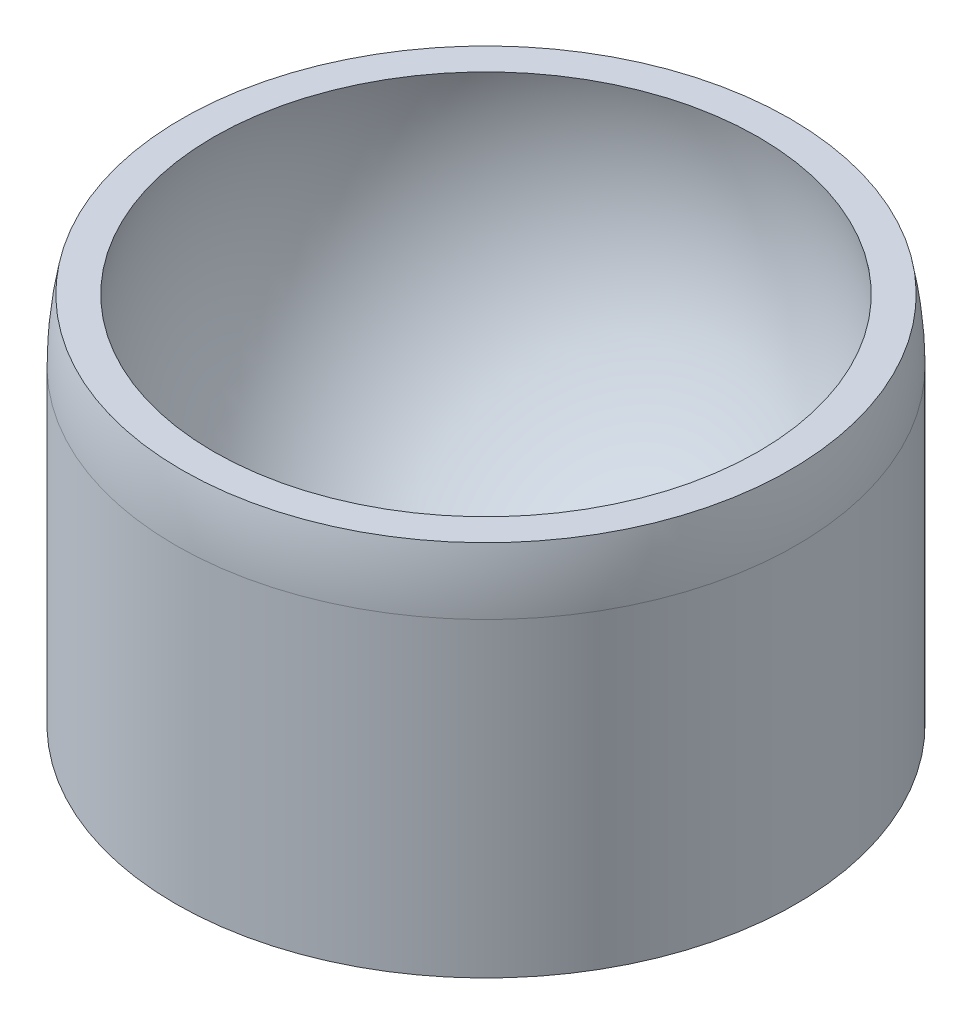
ISO-10303-21;
HEADER;
FILE_DESCRIPTION(('STEP AP214'),'2;1');
FILE_NAME('part.step','',(''),(''),'','','');
FILE_SCHEMA(('AUTOMOTIVE_DESIGN { 1 0 10303 214 1 1 1 1 }'));
ENDSEC;
DATA;
#1=APPLICATION_CONTEXT('core data for automotive mechanical design processes');
#2=APPLICATION_PROTOCOL_DEFINITION('international standard','automotive_design',2000,#1);
#3=PRODUCT_CONTEXT('',#1,'mechanical');
#4=PRODUCT('Part','Part','',(#3));
#5=PRODUCT_RELATED_PRODUCT_CATEGORY('part','',(#4));
#6=PRODUCT_DEFINITION_FORMATION('','',#4);
#7=PRODUCT_DEFINITION_CONTEXT('part definition',#1,'design');
#8=PRODUCT_DEFINITION('design','',#6,#7);
#9=PRODUCT_DEFINITION_SHAPE('','',#8);
#10=(LENGTH_UNIT() NAMED_UNIT(*) SI_UNIT(.MILLI.,.METRE.));
#11=(NAMED_UNIT(*) PLANE_ANGLE_UNIT() SI_UNIT($,.RADIAN.));
#12=(NAMED_UNIT(*) SI_UNIT($,.STERADIAN.) SOLID_ANGLE_UNIT());
#13=UNCERTAINTY_MEASURE_WITH_UNIT(LENGTH_MEASURE(1.E-05),#10,'distance_accuracy_value','');
#14=(GEOMETRIC_REPRESENTATION_CONTEXT(3) GLOBAL_UNCERTAINTY_ASSIGNED_CONTEXT((#13)) GLOBAL_UNIT_ASSIGNED_CONTEXT((#10,
#11,#12)) REPRESENTATION_CONTEXT('',''));
#15=CARTESIAN_POINT('',(0.,0.,0.));
#16=DIRECTION('',(0.,0.,1.));
#17=DIRECTION('',(1.,0.,0.));
#18=AXIS2_PLACEMENT_3D('',#15,#16,#17);
#19=CARTESIAN_POINT('',(0.,0.,0.));
#20=DIRECTION('',(0.,-1.,0.));
#21=DIRECTION('',(1.,0.,0.));
#22=AXIS2_PLACEMENT_3D('',#19,#20,#21);
#23=SPHERICAL_SURFACE('',#22,10.);
#24=CARTESIAN_POINT('',(0.,0.,0.));
#25=DIRECTION('',(0.,-1.,0.));
#26=DIRECTION('',(0.,0.,-1.));
#27=AXIS2_PLACEMENT_3D('',#24,#25,#26);
#28=CIRCLE('',#27,10.);
#29=CARTESIAN_POINT('',(0.,0.,-10.));
#30=VERTEX_POINT('',#29);
#31=EDGE_CURVE('E62',#30,#30,#28,.T.);
#32=ORIENTED_EDGE('',*,*,#31,.F.);
#33=EDGE_LOOP('',(#32));
#34=FACE_BOUND('',#33,.T.);
#35=CARTESIAN_POINT('',(0.,2.,0.));
#36=DIRECTION('',(0.,1.,0.));
#37=DIRECTION('',(0.,0.,1.));
#38=AXIS2_PLACEMENT_3D('',#35,#36,#37);
#39=CIRCLE('',#38,9.79795897113271);
#40=CARTESIAN_POINT('',(0.,2.,9.79795897113271));
#41=VERTEX_POINT('',#40);
#42=EDGE_CURVE('E11',#41,#41,#39,.T.);
#43=ORIENTED_EDGE('',*,*,#42,.F.);
#44=EDGE_LOOP('',(#43));
#45=FACE_BOUND('',#44,.T.);
#46=ADVANCED_FACE('F43',(#34,#45),#23,.T.);
#47=CARTESIAN_POINT('',(20.,2.,10.));
#48=DIRECTION('',(0.,1.,0.));
#49=DIRECTION('',(0.,0.,1.));
#50=AXIS2_PLACEMENT_3D('',#47,#48,#49);
#51=PLANE('',#50);
#52=CARTESIAN_POINT('',(0.,2.,0.));
#53=DIRECTION('',(0.,1.,0.));
#54=DIRECTION('',(0.,0.,1.));
#55=AXIS2_PLACEMENT_3D('',#52,#53,#54);
#56=CIRCLE('',#55,8.77496438739212);
#57=CARTESIAN_POINT('',(0.,2.,8.77496438739212));
#58=VERTEX_POINT('',#57);
#59=EDGE_CURVE('E49',#58,#58,#56,.T.);
#60=ORIENTED_EDGE('',*,*,#59,.F.);
#61=EDGE_LOOP('',(#60));
#62=FACE_BOUND('',#61,.T.);
#63=ORIENTED_EDGE('',*,*,#42,.T.);
#64=EDGE_LOOP('',(#63));
#65=FACE_BOUND('',#64,.T.);
#66=ADVANCED_FACE('F70',(#62,#65),#51,.T.);
#67=CARTESIAN_POINT('',(0.,0.,0.));
#68=DIRECTION('',(0.,-1.,0.));
#69=DIRECTION('',(1.,0.,0.));
#70=AXIS2_PLACEMENT_3D('',#67,#68,#69);
#71=SPHERICAL_SURFACE('',#70,9.);
#72=ORIENTED_EDGE('',*,*,#59,.T.);
#73=EDGE_LOOP('',(#72));
#74=FACE_BOUND('',#73,.T.);
#75=ADVANCED_FACE('F56',(#74),#71,.F.);
#76=CARTESIAN_POINT('',(0.,-10.,0.));
#77=DIRECTION('',(0.,1.,0.));
#78=DIRECTION('',(0.,0.,1.));
#79=AXIS2_PLACEMENT_3D('',#76,#77,#78);
#80=PLANE('',#79);
#81=CARTESIAN_POINT('',(0.,-10.,0.));
#82=VERTEX_POINT('',#81);
#83=VERTEX_LOOP('',#82);
#84=FACE_BOUND('',#83,.T.);
#85=CARTESIAN_POINT('',(0.,-10.,0.));
#86=DIRECTION('',(0.,1.,0.));
#87=DIRECTION('',(0.,0.,1.));
#88=AXIS2_PLACEMENT_3D('',#85,#86,#87);
#89=CIRCLE('',#88,10.);
#90=CARTESIAN_POINT('',(0.,-10.,-10.));
#91=VERTEX_POINT('',#90);
#92=EDGE_CURVE('E60',#91,#91,#89,.T.);
#93=ORIENTED_EDGE('',*,*,#92,.F.);
#94=EDGE_LOOP('',(#93));
#95=FACE_BOUND('',#94,.T.);
#96=ADVANCED_FACE('F52',(#84,#95),#80,.F.);
#97=CARTESIAN_POINT('',(0.,2.002,0.));
#98=DIRECTION('',(0.,-1.,0.));
#99=DIRECTION('',(0.,0.,-1.));
#100=AXIS2_PLACEMENT_3D('',#97,#98,#99);
#101=CYLINDRICAL_SURFACE('',#100,10.);
#102=CARTESIAN_POINT('',(0.,0.,-10.));
#103=CARTESIAN_POINT('',(0.,-0.104166666666666,-10.));
#104=CARTESIAN_POINT('',(0.,-0.208333333333333,-10.));
#105=CARTESIAN_POINT('',(0.,-0.416666666666666,-10.));
#106=CARTESIAN_POINT('',(0.,-0.520833333333333,-10.));
#107=CARTESIAN_POINT('',(0.,-0.729166666666666,-10.));
#108=CARTESIAN_POINT('',(0.,-0.833333333333333,-10.));
#109=CARTESIAN_POINT('',(0.,-1.04166666666667,-10.));
#110=CARTESIAN_POINT('',(0.,-1.14583333333333,-10.));
#111=CARTESIAN_POINT('',(0.,-1.35416666666667,-10.));
#112=CARTESIAN_POINT('',(0.,-1.45833333333333,-10.));
#113=CARTESIAN_POINT('',(0.,-1.66666666666667,-10.));
#114=CARTESIAN_POINT('',(0.,-1.77083333333333,-10.));
#115=CARTESIAN_POINT('',(0.,-1.97916666666667,-10.));
#116=CARTESIAN_POINT('',(0.,-2.08333333333333,-10.));
#117=CARTESIAN_POINT('',(0.,-2.29166666666667,-10.));
#118=CARTESIAN_POINT('',(0.,-2.39583333333333,-10.));
#119=CARTESIAN_POINT('',(0.,-2.60416666666667,-10.));
#120=CARTESIAN_POINT('',(0.,-2.70833333333333,-10.));
#121=CARTESIAN_POINT('',(0.,-2.91666666666667,-10.));
#122=CARTESIAN_POINT('',(0.,-3.02083333333333,-10.));
#123=CARTESIAN_POINT('',(0.,-3.22916666666667,-10.));
#124=CARTESIAN_POINT('',(0.,-3.33333333333333,-10.));
#125=CARTESIAN_POINT('',(0.,-3.54166666666667,-10.));
#126=CARTESIAN_POINT('',(0.,-3.64583333333333,-10.));
#127=CARTESIAN_POINT('',(0.,-3.85416666666667,-10.));
#128=CARTESIAN_POINT('',(0.,-3.95833333333333,-10.));
#129=CARTESIAN_POINT('',(0.,-4.16666666666667,-10.));
#130=CARTESIAN_POINT('',(0.,-4.27083333333333,-10.));
#131=CARTESIAN_POINT('',(0.,-4.47916666666667,-10.));
#132=CARTESIAN_POINT('',(0.,-4.58333333333333,-10.));
#133=CARTESIAN_POINT('',(0.,-4.79166666666667,-10.));
#134=CARTESIAN_POINT('',(0.,-4.89583333333333,-10.));
#135=CARTESIAN_POINT('',(0.,-5.10416666666667,-10.));
#136=CARTESIAN_POINT('',(0.,-5.20833333333333,-10.));
#137=CARTESIAN_POINT('',(0.,-5.41666666666667,-10.));
#138=CARTESIAN_POINT('',(0.,-5.52083333333333,-10.));
#139=CARTESIAN_POINT('',(0.,-5.72916666666667,-10.));
#140=CARTESIAN_POINT('',(0.,-5.83333333333333,-10.));
#141=CARTESIAN_POINT('',(0.,-6.04166666666667,-10.));
#142=CARTESIAN_POINT('',(0.,-6.14583333333333,-10.));
#143=CARTESIAN_POINT('',(0.,-6.35416666666667,-10.));
#144=CARTESIAN_POINT('',(0.,-6.45833333333333,-10.));
#145=CARTESIAN_POINT('',(0.,-6.66666666666667,-10.));
#146=CARTESIAN_POINT('',(0.,-6.77083333333333,-10.));
#147=CARTESIAN_POINT('',(0.,-6.97916666666667,-10.));
#148=CARTESIAN_POINT('',(0.,-7.08333333333333,-10.));
#149=CARTESIAN_POINT('',(0.,-7.29166666666667,-10.));
#150=CARTESIAN_POINT('',(0.,-7.39583333333333,-10.));
#151=CARTESIAN_POINT('',(0.,-7.60416666666667,-10.));
#152=CARTESIAN_POINT('',(0.,-7.70833333333333,-10.));
#153=CARTESIAN_POINT('',(0.,-7.91666666666667,-10.));
#154=CARTESIAN_POINT('',(0.,-8.02083333333333,-10.));
#155=CARTESIAN_POINT('',(0.,-8.22916666666667,-10.));
#156=CARTESIAN_POINT('',(0.,-8.33333333333333,-10.));
#157=CARTESIAN_POINT('',(0.,-8.54166666666667,-10.));
#158=CARTESIAN_POINT('',(0.,-8.64583333333333,-10.));
#159=CARTESIAN_POINT('',(0.,-8.85416666666667,-10.));
#160=CARTESIAN_POINT('',(0.,-8.95833333333333,-10.));
#161=CARTESIAN_POINT('',(0.,-9.16666666666667,-10.));
#162=CARTESIAN_POINT('',(0.,-9.27083333333333,-10.));
#163=CARTESIAN_POINT('',(0.,-9.47916666666667,-10.));
#164=CARTESIAN_POINT('',(0.,-9.58333333333333,-10.));
#165=CARTESIAN_POINT('',(0.,-9.79166666666667,-10.));
#166=CARTESIAN_POINT('',(0.,-9.89583333333333,-10.));
#167=CARTESIAN_POINT('',(0.,-10.,-10.));
#168=B_SPLINE_CURVE_WITH_KNOTS('',3,(#102,#103,#104,#105,#106,#107,#108,#109,#110,#111,#112,
#113,#114,#115,#116,#117,#118,#119,#120,#121,#122,#123,#124,#125,#126,#127,#128,#129,#130,#131,
#132,#133,#134,#135,#136,#137,#138,#139,#140,#141,#142,#143,#144,#145,#146,#147,#148,#149,#150,
#151,#152,#153,#154,#155,#156,#157,#158,#159,#160,#161,#162,#163,#164,#165,#166,#167),
.UNSPECIFIED.,.F.,.F.,(4,2,2,2,2,2,2,2,2,2,2,2,2,2,2,2,2,2,2,2,2,2,2,2,2,2,2,2,2,2,2,2,4),(0.,
0.3125,0.625,0.9375,1.25,1.5625,1.875,2.1875,2.5,2.8125,3.125,3.4375,3.75,4.0625,4.375,4.6875,
5.,5.3125,5.625,5.9375,6.25,6.5625,6.875,7.1875,7.5,7.8125,8.125,8.4375,8.75,9.0625,9.375,
9.6875,10.),.UNSPECIFIED.);
#169=EDGE_CURVE('BSEAM55',#30,#91,#168,.T.);
#170=ORIENTED_EDGE('',*,*,#31,.T.);
#171=ORIENTED_EDGE('',*,*,#92,.T.);
#172=ORIENTED_EDGE('',*,*,#169,.T.);
#173=ORIENTED_EDGE('',*,*,#169,.F.);
#174=EDGE_LOOP('',(#170,#172,#171,#173));
#175=FACE_BOUND('',#174,.T.);
#176=ADVANCED_FACE('F55',(#175),#101,.T.);
#177=CLOSED_SHELL('',(#46,#66,#75,#96,#176));
#178=MANIFOLD_SOLID_BREP('B2',#177);
#179=ADVANCED_BREP_SHAPE_REPRESENTATION('',(#18,#178),#14);
#180=SHAPE_DEFINITION_REPRESENTATION(#9,#179);
ENDSEC;
END-ISO-10303-21;
